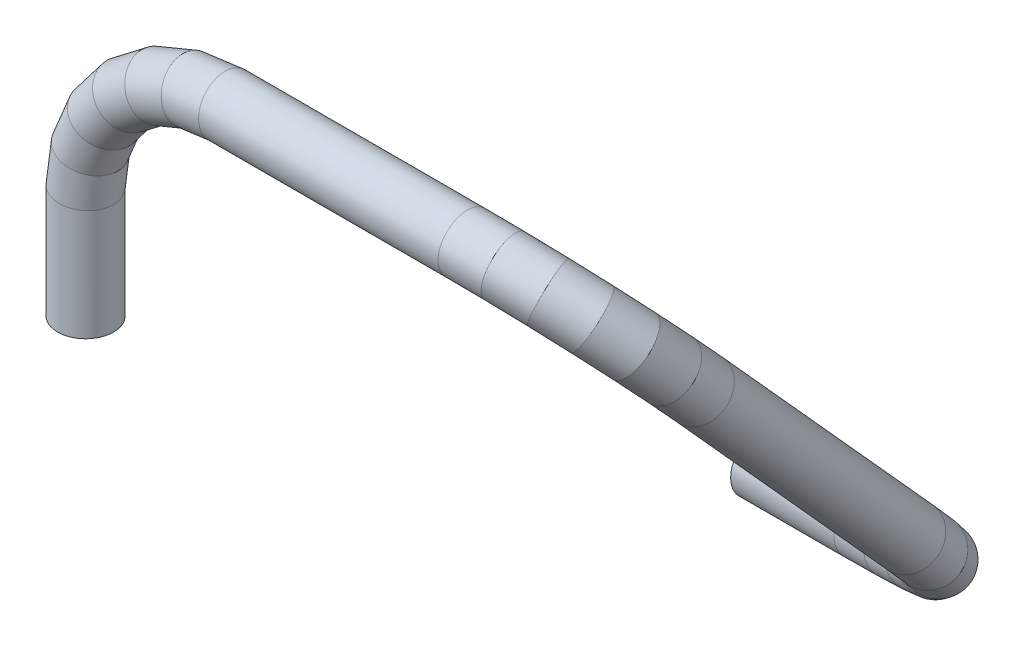
ISO-10303-21;
HEADER;
FILE_DESCRIPTION(('STEP AP214'),'2;1');
FILE_NAME('part.step','',(''),(''),'','','');
FILE_SCHEMA(('AUTOMOTIVE_DESIGN { 1 0 10303 214 1 1 1 1 }'));
ENDSEC;
DATA;
#1=APPLICATION_CONTEXT('core data for automotive mechanical design processes');
#2=APPLICATION_PROTOCOL_DEFINITION('international standard','automotive_design',2000,#1);
#3=PRODUCT_CONTEXT('',#1,'mechanical');
#4=PRODUCT('Part','Part','',(#3));
#5=PRODUCT_RELATED_PRODUCT_CATEGORY('part','',(#4));
#6=PRODUCT_DEFINITION_FORMATION('','',#4);
#7=PRODUCT_DEFINITION_CONTEXT('part definition',#1,'design');
#8=PRODUCT_DEFINITION('design','',#6,#7);
#9=PRODUCT_DEFINITION_SHAPE('','',#8);
#10=(LENGTH_UNIT() NAMED_UNIT(*) SI_UNIT(.MILLI.,.METRE.));
#11=(NAMED_UNIT(*) PLANE_ANGLE_UNIT() SI_UNIT($,.RADIAN.));
#12=(NAMED_UNIT(*) SI_UNIT($,.STERADIAN.) SOLID_ANGLE_UNIT());
#13=UNCERTAINTY_MEASURE_WITH_UNIT(LENGTH_MEASURE(1.E-05),#10,'distance_accuracy_value','');
#14=(GEOMETRIC_REPRESENTATION_CONTEXT(3) GLOBAL_UNCERTAINTY_ASSIGNED_CONTEXT((#13)) GLOBAL_UNIT_ASSIGNED_CONTEXT((#10,
#11,#12)) REPRESENTATION_CONTEXT('',''));
#15=CARTESIAN_POINT('',(0.,0.,0.));
#16=DIRECTION('',(0.,0.,1.));
#17=DIRECTION('',(1.,0.,0.));
#18=AXIS2_PLACEMENT_3D('',#15,#16,#17);
#19=CARTESIAN_POINT('',(20.,108.,0.));
#20=DIRECTION('',(0.,-1.,0.));
#21=DIRECTION('',(0.,0.,-1.));
#22=AXIS2_PLACEMENT_3D('',#19,#20,#21);
#23=CYLINDRICAL_SURFACE('',#22,3.8735);
#24=CARTESIAN_POINT('',(20.,108.,0.));
#25=DIRECTION('',(-0.0654031292301429,-0.997858923238603,0.));
#26=DIRECTION('',(-0.997858923238604,0.0654031292301429,0.));
#27=AXIS2_PLACEMENT_3D('',#24,#25,#26);
#28=ELLIPSE('',#27,3.88181125587208,3.8735);
#29=CARTESIAN_POINT('',(16.1265,108.253882603215,0.));
#30=VERTEX_POINT('',#29);
#31=EDGE_CURVE('E77',#30,#30,#28,.T.);
#32=ORIENTED_EDGE('',*,*,#31,.F.);
#33=EDGE_LOOP('',(#32));
#34=FACE_BOUND('',#33,.T.);
#35=CARTESIAN_POINT('',(20.,88.9,0.));
#36=DIRECTION('',(0.,-1.,0.));
#37=DIRECTION('',(0.,0.,-1.));
#38=AXIS2_PLACEMENT_3D('',#35,#36,#37);
#39=CIRCLE('',#38,3.8735);
#40=CARTESIAN_POINT('',(20.,88.9,-3.8735));
#41=VERTEX_POINT('',#40);
#42=EDGE_CURVE('E11',#41,#41,#39,.F.);
#43=ORIENTED_EDGE('',*,*,#42,.F.);
#44=EDGE_LOOP('',(#43));
#45=FACE_BOUND('',#44,.T.);
#46=ADVANCED_FACE('F58',(#34,#45),#23,.F.);
#47=CARTESIAN_POINT('',(20.,108.,0.));
#48=DIRECTION('',(0.,-1.,0.));
#49=DIRECTION('',(0.,0.,-1.));
#50=AXIS2_PLACEMENT_3D('',#47,#48,#49);
#51=CYLINDRICAL_SURFACE('',#50,4.7625);
#52=CARTESIAN_POINT('',(20.,108.,0.));
#53=DIRECTION('',(-0.0654031292301429,-0.997858923238603,0.));
#54=DIRECTION('',(-0.997858923238604,0.0654031292301429,0.));
#55=AXIS2_PLACEMENT_3D('',#52,#53,#54);
#56=ELLIPSE('',#55,4.77271875721977,4.7625);
#57=CARTESIAN_POINT('',(15.2375,108.312150741658,0.));
#58=VERTEX_POINT('',#57);
#59=EDGE_CURVE('E75',#58,#58,#56,.T.);
#60=ORIENTED_EDGE('',*,*,#59,.T.);
#61=EDGE_LOOP('',(#60));
#62=FACE_BOUND('',#61,.T.);
#63=CARTESIAN_POINT('',(20.,88.9,0.));
#64=DIRECTION('',(0.,-1.,0.));
#65=DIRECTION('',(0.,0.,-1.));
#66=AXIS2_PLACEMENT_3D('',#63,#64,#65);
#67=CIRCLE('',#66,4.7625);
#68=CARTESIAN_POINT('',(20.,88.9,-4.7625));
#69=VERTEX_POINT('',#68);
#70=EDGE_CURVE('E61',#69,#69,#67,.F.);
#71=ORIENTED_EDGE('',*,*,#70,.T.);
#72=EDGE_LOOP('',(#71));
#73=FACE_BOUND('',#72,.T.);
#74=ADVANCED_FACE('F65',(#62,#73),#51,.T.);
#75=CARTESIAN_POINT('',(20.8177801690624,114.21165708246,0.));
#76=DIRECTION('',(-0.130526192220051,-0.99144486137381,0.));
#77=DIRECTION('',(0.99144486137381,-0.130526192220051,0.));
#78=AXIS2_PLACEMENT_3D('',#75,#76,#77);
#79=CYLINDRICAL_SURFACE('',#78,4.7625);
#80=CARTESIAN_POINT('',(20.8177801690624,114.21165708246,0.));
#81=DIRECTION('',(-0.258819045102521,-0.965925826289068,0.));
#82=DIRECTION('',(-0.965925826289068,0.258819045102521,0.));
#83=AXIS2_PLACEMENT_3D('',#80,#81,#82);
#84=ELLIPSE('',#83,4.80359542476298,4.7625);
#85=CARTESIAN_POINT('',(16.1778632892398,115.454919063356,0.));
#86=VERTEX_POINT('',#85);
#87=EDGE_CURVE('E78',#86,#86,#84,.F.);
#88=ORIENTED_EDGE('',*,*,#87,.F.);
#89=EDGE_LOOP('',(#88));
#90=FACE_BOUND('',#89,.T.);
#91=ORIENTED_EDGE('',*,*,#59,.F.);
#92=EDGE_LOOP('',(#91));
#93=FACE_BOUND('',#92,.T.);
#94=ADVANCED_FACE('F215',(#90,#93),#79,.T.);
#95=CARTESIAN_POINT('',(20.8177801690624,114.21165708246,0.));
#96=DIRECTION('',(-0.130526192220051,-0.99144486137381,0.));
#97=DIRECTION('',(0.99144486137381,-0.130526192220051,0.));
#98=AXIS2_PLACEMENT_3D('',#95,#96,#97);
#99=CYLINDRICAL_SURFACE('',#98,3.8735);
#100=CARTESIAN_POINT('',(20.8177801690624,114.21165708246,0.));
#101=DIRECTION('',(-0.258819045102521,-0.965925826289068,0.));
#102=DIRECTION('',(-0.965925826289068,0.258819045102521,0.));
#103=AXIS2_PLACEMENT_3D('',#100,#101,#102);
#104=ELLIPSE('',#103,3.90692427880722,3.8735);
#105=CARTESIAN_POINT('',(17.0439811068067,115.222843493589,0.));
#106=VERTEX_POINT('',#105);
#107=EDGE_CURVE('E80',#106,#106,#104,.F.);
#108=ORIENTED_EDGE('',*,*,#107,.T.);
#109=EDGE_LOOP('',(#108));
#110=FACE_BOUND('',#109,.T.);
#111=ORIENTED_EDGE('',*,*,#31,.T.);
#112=EDGE_LOOP('',(#111));
#113=FACE_BOUND('',#112,.T.);
#114=ADVANCED_FACE('F202',(#110,#113),#99,.F.);
#115=CARTESIAN_POINT('',(23.2153903091735,120.,0.));
#116=DIRECTION('',(-0.38268343236509,-0.923879532511287,0.));
#117=DIRECTION('',(0.923879532511287,-0.38268343236509,0.));
#118=AXIS2_PLACEMENT_3D('',#115,#116,#117);
#119=CYLINDRICAL_SURFACE('',#118,3.8735);
#120=CARTESIAN_POINT('',(23.2153903091735,120.,0.));
#121=DIRECTION('',(-0.5,-0.866025403784439,0.));
#122=DIRECTION('',(-0.866025403784439,0.5,0.));
#123=AXIS2_PLACEMENT_3D('',#120,#121,#122);
#124=ELLIPSE('',#123,3.90692427880722,3.8735);
#125=CARTESIAN_POINT('',(19.8318946330642,121.953462139404,0.));
#126=VERTEX_POINT('',#125);
#127=EDGE_CURVE('E81',#126,#126,#124,.T.);
#128=ORIENTED_EDGE('',*,*,#127,.F.);
#129=EDGE_LOOP('',(#128));
#130=FACE_BOUND('',#129,.T.);
#131=ORIENTED_EDGE('',*,*,#107,.F.);
#132=EDGE_LOOP('',(#131));
#133=FACE_BOUND('',#132,.T.);
#134=ADVANCED_FACE('F220',(#130,#133),#119,.F.);
#135=CARTESIAN_POINT('',(23.2153903091735,120.,0.));
#136=DIRECTION('',(-0.38268343236509,-0.923879532511287,0.));
#137=DIRECTION('',(0.923879532511287,-0.38268343236509,0.));
#138=AXIS2_PLACEMENT_3D('',#135,#136,#137);
#139=CYLINDRICAL_SURFACE('',#138,4.7625);
#140=CARTESIAN_POINT('',(23.2153903091735,120.,0.));
#141=DIRECTION('',(-0.5,-0.866025403784439,0.));
#142=DIRECTION('',(-0.866025403784439,0.5,0.));
#143=AXIS2_PLACEMENT_3D('',#140,#141,#142);
#144=ELLIPSE('',#143,4.80359542476298,4.7625);
#145=CARTESIAN_POINT('',(19.055354641826,122.401797712381,0.));
#146=VERTEX_POINT('',#145);
#147=EDGE_CURVE('E82',#146,#146,#144,.T.);
#148=ORIENTED_EDGE('',*,*,#147,.T.);
#149=EDGE_LOOP('',(#148));
#150=FACE_BOUND('',#149,.T.);
#151=ORIENTED_EDGE('',*,*,#87,.T.);
#152=EDGE_LOOP('',(#151));
#153=FACE_BOUND('',#152,.T.);
#154=ADVANCED_FACE('F225',(#150,#153),#139,.T.);
#155=CARTESIAN_POINT('',(27.0294372515229,124.970562748477,0.));
#156=DIRECTION('',(-0.608761429008721,-0.793353340291235,0.));
#157=DIRECTION('',(0.793353340291235,-0.608761429008721,0.));
#158=AXIS2_PLACEMENT_3D('',#155,#156,#157);
#159=CYLINDRICAL_SURFACE('',#158,4.7625);
#160=CARTESIAN_POINT('',(27.0294372515229,124.970562748477,0.));
#161=DIRECTION('',(-0.707106781186547,-0.707106781186548,0.));
#162=DIRECTION('',(-0.707106781186548,0.707106781186547,0.));
#163=AXIS2_PLACEMENT_3D('',#160,#161,#162);
#164=ELLIPSE('',#163,4.80359542476298,4.7625);
#165=CARTESIAN_POINT('',(23.6327823525963,128.367217647404,0.));
#166=VERTEX_POINT('',#165);
#167=EDGE_CURVE('E86',#166,#166,#164,.F.);
#168=ORIENTED_EDGE('',*,*,#167,.F.);
#169=EDGE_LOOP('',(#168));
#170=FACE_BOUND('',#169,.T.);
#171=ORIENTED_EDGE('',*,*,#147,.F.);
#172=EDGE_LOOP('',(#171));
#173=FACE_BOUND('',#172,.T.);
#174=ADVANCED_FACE('F223',(#170,#173),#159,.T.);
#175=CARTESIAN_POINT('',(27.0294372515229,124.970562748477,0.));
#176=DIRECTION('',(-0.608761429008721,-0.793353340291235,0.));
#177=DIRECTION('',(0.793353340291235,-0.608761429008721,0.));
#178=AXIS2_PLACEMENT_3D('',#175,#176,#177);
#179=CYLINDRICAL_SURFACE('',#178,3.8735);
#180=CARTESIAN_POINT('',(27.0294372515229,124.970562748477,0.));
#181=DIRECTION('',(-0.707106781186547,-0.707106781186548,0.));
#182=DIRECTION('',(-0.707106781186548,0.707106781186547,0.));
#183=AXIS2_PLACEMENT_3D('',#180,#181,#182);
#184=ELLIPSE('',#183,3.90692427880722,3.8735);
#185=CARTESIAN_POINT('',(24.2668246003959,127.733175399604,0.));
#186=VERTEX_POINT('',#185);
#187=EDGE_CURVE('E83',#186,#186,#184,.F.);
#188=ORIENTED_EDGE('',*,*,#187,.T.);
#189=EDGE_LOOP('',(#188));
#190=FACE_BOUND('',#189,.T.);
#191=ORIENTED_EDGE('',*,*,#127,.T.);
#192=EDGE_LOOP('',(#191));
#193=FACE_BOUND('',#192,.T.);
#194=ADVANCED_FACE('F228',(#190,#193),#179,.F.);
#195=CARTESIAN_POINT('',(32.,128.784609690827,0.));
#196=DIRECTION('',(-0.793353340291235,-0.608761429008721,0.));
#197=DIRECTION('',(0.608761429008721,-0.793353340291235,0.));
#198=AXIS2_PLACEMENT_3D('',#195,#196,#197);
#199=CYLINDRICAL_SURFACE('',#198,3.8735);
#200=CARTESIAN_POINT('',(32.,128.784609690827,0.));
#201=DIRECTION('',(-0.866025403784438,-0.5,0.));
#202=DIRECTION('',(-0.5,0.866025403784439,0.));
#203=AXIS2_PLACEMENT_3D('',#200,#201,#202);
#204=ELLIPSE('',#203,3.90692427880722,3.8735);
#205=CARTESIAN_POINT('',(30.0465378605964,132.168105366936,0.));
#206=VERTEX_POINT('',#205);
#207=EDGE_CURVE('E95',#206,#206,#204,.T.);
#208=ORIENTED_EDGE('',*,*,#207,.F.);
#209=EDGE_LOOP('',(#208));
#210=FACE_BOUND('',#209,.T.);
#211=ORIENTED_EDGE('',*,*,#187,.F.);
#212=EDGE_LOOP('',(#211));
#213=FACE_BOUND('',#212,.T.);
#214=ADVANCED_FACE('F235',(#210,#213),#199,.F.);
#215=CARTESIAN_POINT('',(32.,128.784609690827,0.));
#216=DIRECTION('',(-0.793353340291235,-0.608761429008721,0.));
#217=DIRECTION('',(0.608761429008721,-0.793353340291235,0.));
#218=AXIS2_PLACEMENT_3D('',#215,#216,#217);
#219=CYLINDRICAL_SURFACE('',#218,4.7625);
#220=CARTESIAN_POINT('',(32.,128.784609690827,0.));
#221=DIRECTION('',(-0.866025403784438,-0.5,0.));
#222=DIRECTION('',(-0.5,0.866025403784439,0.));
#223=AXIS2_PLACEMENT_3D('',#220,#221,#222);
#224=ELLIPSE('',#223,4.80359542476298,4.7625);
#225=CARTESIAN_POINT('',(29.5982022876185,132.944645358174,0.));
#226=VERTEX_POINT('',#225);
#227=EDGE_CURVE('E90',#226,#226,#224,.T.);
#228=ORIENTED_EDGE('',*,*,#227,.T.);
#229=EDGE_LOOP('',(#228));
#230=FACE_BOUND('',#229,.T.);
#231=ORIENTED_EDGE('',*,*,#167,.T.);
#232=EDGE_LOOP('',(#231));
#233=FACE_BOUND('',#232,.T.);
#234=ADVANCED_FACE('F236',(#230,#233),#219,.T.);
#235=CARTESIAN_POINT('',(37.7883429175395,131.182219830938,0.));
#236=DIRECTION('',(-0.923879532511287,-0.38268343236509,0.));
#237=DIRECTION('',(0.38268343236509,-0.923879532511287,0.));
#238=AXIS2_PLACEMENT_3D('',#235,#236,#237);
#239=CYLINDRICAL_SURFACE('',#238,4.7625);
#240=CARTESIAN_POINT('',(37.7883429175395,131.182219830938,0.));
#241=DIRECTION('',(-0.965925826289068,-0.258819045102521,0.));
#242=DIRECTION('',(-0.258819045102521,0.965925826289068,0.));
#243=AXIS2_PLACEMENT_3D('',#240,#241,#242);
#244=ELLIPSE('',#243,4.80359542476298,4.7625);
#245=CARTESIAN_POINT('',(36.5450809366435,135.82213671076,0.));
#246=VERTEX_POINT('',#245);
#247=EDGE_CURVE('E96',#246,#246,#244,.F.);
#248=ORIENTED_EDGE('',*,*,#247,.F.);
#249=EDGE_LOOP('',(#248));
#250=FACE_BOUND('',#249,.T.);
#251=ORIENTED_EDGE('',*,*,#227,.F.);
#252=EDGE_LOOP('',(#251));
#253=FACE_BOUND('',#252,.T.);
#254=ADVANCED_FACE('F242',(#250,#253),#239,.T.);
#255=CARTESIAN_POINT('',(37.7883429175395,131.182219830938,0.));
#256=DIRECTION('',(-0.923879532511287,-0.38268343236509,0.));
#257=DIRECTION('',(0.38268343236509,-0.923879532511287,0.));
#258=AXIS2_PLACEMENT_3D('',#255,#256,#257);
#259=CYLINDRICAL_SURFACE('',#258,3.8735);
#260=CARTESIAN_POINT('',(37.7883429175395,131.182219830938,0.));
#261=DIRECTION('',(-0.965925826289068,-0.258819045102521,0.));
#262=DIRECTION('',(-0.258819045102521,0.965925826289068,0.));
#263=AXIS2_PLACEMENT_3D('',#260,#261,#262);
#264=ELLIPSE('',#263,3.90692427880722,3.8735);
#265=CARTESIAN_POINT('',(36.7771565064108,134.956018893193,0.));
#266=VERTEX_POINT('',#265);
#267=EDGE_CURVE('E91',#266,#266,#264,.F.);
#268=ORIENTED_EDGE('',*,*,#267,.T.);
#269=EDGE_LOOP('',(#268));
#270=FACE_BOUND('',#269,.T.);
#271=ORIENTED_EDGE('',*,*,#207,.T.);
#272=EDGE_LOOP('',(#271));
#273=FACE_BOUND('',#272,.T.);
#274=ADVANCED_FACE('F247',(#270,#273),#259,.F.);
#275=CARTESIAN_POINT('',(44.,132.,0.));
#276=DIRECTION('',(-0.99144486137381,-0.130526192220052,0.));
#277=DIRECTION('',(0.130526192220052,-0.99144486137381,0.));
#278=AXIS2_PLACEMENT_3D('',#275,#276,#277);
#279=CYLINDRICAL_SURFACE('',#278,3.8735);
#280=CARTESIAN_POINT('',(44.,132.,0.));
#281=DIRECTION('',(-0.997858923238603,-0.0654031292301435,0.));
#282=DIRECTION('',(-0.0654031292301435,0.997858923238603,0.));
#283=AXIS2_PLACEMENT_3D('',#280,#281,#282);
#284=ELLIPSE('',#283,3.88181125587208,3.8735);
#285=CARTESIAN_POINT('',(43.7461173967852,135.8735,0.));
#286=VERTEX_POINT('',#285);
#287=EDGE_CURVE('E99',#286,#286,#284,.T.);
#288=ORIENTED_EDGE('',*,*,#287,.F.);
#289=EDGE_LOOP('',(#288));
#290=FACE_BOUND('',#289,.T.);
#291=ORIENTED_EDGE('',*,*,#267,.F.);
#292=EDGE_LOOP('',(#291));
#293=FACE_BOUND('',#292,.T.);
#294=ADVANCED_FACE('F246',(#290,#293),#279,.F.);
#295=CARTESIAN_POINT('',(44.,132.,0.));
#296=DIRECTION('',(-0.99144486137381,-0.130526192220052,0.));
#297=DIRECTION('',(0.130526192220052,-0.99144486137381,0.));
#298=AXIS2_PLACEMENT_3D('',#295,#296,#297);
#299=CYLINDRICAL_SURFACE('',#298,4.7625);
#300=CARTESIAN_POINT('',(44.,132.,0.));
#301=DIRECTION('',(-0.997858923238603,-0.0654031292301435,0.));
#302=DIRECTION('',(-0.0654031292301435,0.997858923238603,0.));
#303=AXIS2_PLACEMENT_3D('',#300,#301,#302);
#304=ELLIPSE('',#303,4.77271875721977,4.7625);
#305=CARTESIAN_POINT('',(43.6878492583424,136.7625,0.));
#306=VERTEX_POINT('',#305);
#307=EDGE_CURVE('E100',#306,#306,#304,.T.);
#308=ORIENTED_EDGE('',*,*,#307,.T.);
#309=EDGE_LOOP('',(#308));
#310=FACE_BOUND('',#309,.T.);
#311=ORIENTED_EDGE('',*,*,#247,.T.);
#312=EDGE_LOOP('',(#311));
#313=FACE_BOUND('',#312,.T.);
#314=ADVANCED_FACE('F255',(#310,#313),#299,.T.);
#315=CARTESIAN_POINT('',(84.5,132.,0.));
#316=DIRECTION('',(-1.,0.,0.));
#317=DIRECTION('',(0.,0.,1.));
#318=AXIS2_PLACEMENT_3D('',#315,#316,#317);
#319=CYLINDRICAL_SURFACE('',#318,4.7625);
#320=CARTESIAN_POINT('',(84.5,132.,0.));
#321=DIRECTION('',(-0.997858923238604,0.0485516940798315,0.0438212541476518));
#322=DIRECTION('',(0.0654031292301419,0.740755706128859,0.668583139575357));
#323=AXIS2_PLACEMENT_3D('',#320,#321,#322);
#324=ELLIPSE('',#323,4.77271875721977,4.7625);
#325=CARTESIAN_POINT('',(84.8121507416576,135.535418653159,3.19095929101219));
#326=VERTEX_POINT('',#325);
#327=EDGE_CURVE('E102',#326,#326,#324,.F.);
#328=ORIENTED_EDGE('',*,*,#327,.F.);
#329=EDGE_LOOP('',(#328));
#330=FACE_BOUND('',#329,.T.);
#331=ORIENTED_EDGE('',*,*,#307,.F.);
#332=EDGE_LOOP('',(#331));
#333=FACE_BOUND('',#332,.T.);
#334=ADVANCED_FACE('F260',(#330,#333),#319,.T.);
#335=CARTESIAN_POINT('',(84.5,132.,0.));
#336=DIRECTION('',(-1.,0.,0.));
#337=DIRECTION('',(0.,0.,1.));
#338=AXIS2_PLACEMENT_3D('',#335,#336,#337);
#339=CYLINDRICAL_SURFACE('',#338,3.8735);
#340=CARTESIAN_POINT('',(84.5,132.,0.));
#341=DIRECTION('',(-0.997858923238604,0.0485516940798315,0.0438212541476518));
#342=DIRECTION('',(0.0654031292301419,0.740755706128859,0.668583139575357));
#343=AXIS2_PLACEMENT_3D('',#340,#341,#342);
#344=ELLIPSE('',#343,3.88181125587208,3.8735);
#345=CARTESIAN_POINT('',(84.7538826032148,134.875473837902,2.59531355668991));
#346=VERTEX_POINT('',#345);
#347=EDGE_CURVE('E101',#346,#346,#344,.F.);
#348=ORIENTED_EDGE('',*,*,#347,.T.);
#349=EDGE_LOOP('',(#348));
#350=FACE_BOUND('',#349,.T.);
#351=ORIENTED_EDGE('',*,*,#287,.T.);
#352=EDGE_LOOP('',(#351));
#353=FACE_BOUND('',#352,.T.);
#354=ADVANCED_FACE('F265',(#350,#353),#339,.F.);
#355=CARTESIAN_POINT('',(90.7116570824605,131.392924878974,-0.547927187081367));
#356=DIRECTION('',(-0.991444861373811,0.0968954823518215,0.087454858957482));
#357=DIRECTION('',(-0.0972681669321937,-0.995258209562549,0.));
#358=AXIS2_PLACEMENT_3D('',#355,#356,#357);
#359=CYLINDRICAL_SURFACE('',#358,3.8735);
#360=CARTESIAN_POINT('',(90.7116570824605,131.392924878974,-0.547927187081367));
#361=DIRECTION('',(-0.965925826289068,0.192133056136109,0.173413341031133));
#362=DIRECTION('',(0.258819045102522,0.717050327313455,0.647187399438436));
#363=AXIS2_PLACEMENT_3D('',#360,#361,#362);
#364=ELLIPSE('',#363,3.90692427880723,3.8735);
#365=CARTESIAN_POINT('',(91.7228434935893,134.194386211882,1.98058497672277));
#366=VERTEX_POINT('',#365);
#367=EDGE_CURVE('E107',#366,#366,#364,.T.);
#368=ORIENTED_EDGE('',*,*,#367,.F.);
#369=EDGE_LOOP('',(#368));
#370=FACE_BOUND('',#369,.T.);
#371=ORIENTED_EDGE('',*,*,#347,.F.);
#372=EDGE_LOOP('',(#371));
#373=FACE_BOUND('',#372,.T.);
#374=ADVANCED_FACE('F264',(#370,#373),#359,.F.);
#375=CARTESIAN_POINT('',(90.7116570824605,131.392924878974,-0.547927187081367));
#376=DIRECTION('',(-0.991444861373811,0.0968954823518215,0.087454858957482));
#377=DIRECTION('',(-0.0972681669321937,-0.995258209562549,0.));
#378=AXIS2_PLACEMENT_3D('',#375,#376,#377);
#379=CYLINDRICAL_SURFACE('',#378,4.7625);
#380=CARTESIAN_POINT('',(90.7116570824605,131.392924878974,-0.547927187081367));
#381=DIRECTION('',(-0.965925826289068,0.192133056136109,0.173413341031133));
#382=DIRECTION('',(0.258819045102522,0.717050327313455,0.647187399438436));
#383=AXIS2_PLACEMENT_3D('',#380,#381,#382);
#384=ELLIPSE('',#383,4.80359542476298,4.7625);
#385=CARTESIAN_POINT('',(91.9549190633565,134.837344550582,2.56089924382536));
#386=VERTEX_POINT('',#385);
#387=EDGE_CURVE('E104',#386,#386,#384,.T.);
#388=ORIENTED_EDGE('',*,*,#387,.T.);
#389=EDGE_LOOP('',(#388));
#390=FACE_BOUND('',#389,.T.);
#391=ORIENTED_EDGE('',*,*,#327,.T.);
#392=EDGE_LOOP('',(#391));
#393=FACE_BOUND('',#392,.T.);
#394=ADVANCED_FACE('F269',(#390,#393),#379,.T.);
#395=CARTESIAN_POINT('',(96.5,129.613070682155,-2.15436841601836));
#396=DIRECTION('',(-0.923879532511285,0.284083180060561,0.256404672760481));
#397=DIRECTION('',(-0.293908687527917,-0.955833501921552,0.));
#398=AXIS2_PLACEMENT_3D('',#395,#396,#397);
#399=CYLINDRICAL_SURFACE('',#398,4.7625);
#400=CARTESIAN_POINT('',(96.5,129.613070682155,-2.15436841601836));
#401=DIRECTION('',(-0.866025403784437,0.37117256201143,0.335008849450091));
#402=DIRECTION('',(0.500000000000002,0.642889735779286,0.580252348232764));
#403=AXIS2_PLACEMENT_3D('',#400,#401,#402);
#404=ELLIPSE('',#403,4.80359542476298,4.7625);
#405=CARTESIAN_POINT('',(98.9017977123815,132.701252875571,0.632929109160526));
#406=VERTEX_POINT('',#405);
#407=EDGE_CURVE('E115',#406,#406,#404,.F.);
#408=ORIENTED_EDGE('',*,*,#407,.F.);
#409=EDGE_LOOP('',(#408));
#410=FACE_BOUND('',#409,.T.);
#411=ORIENTED_EDGE('',*,*,#387,.F.);
#412=EDGE_LOOP('',(#411));
#413=FACE_BOUND('',#412,.T.);
#414=ADVANCED_FACE('F272',(#410,#413),#399,.T.);
#415=CARTESIAN_POINT('',(96.5,129.613070682155,-2.15436841601836));
#416=DIRECTION('',(-0.923879532511285,0.284083180060561,0.256404672760481));
#417=DIRECTION('',(-0.293908687527917,-0.955833501921552,0.));
#418=AXIS2_PLACEMENT_3D('',#415,#416,#417);
#419=CYLINDRICAL_SURFACE('',#418,3.8735);
#420=CARTESIAN_POINT('',(96.5,129.613070682155,-2.15436841601836));
#421=DIRECTION('',(-0.866025403784437,0.37117256201143,0.335008849450091));
#422=DIRECTION('',(0.500000000000002,0.642889735779286,0.580252348232764));
#423=AXIS2_PLACEMENT_3D('',#420,#421,#422);
#424=ELLIPSE('',#423,3.90692427880722,3.8735);
#425=CARTESIAN_POINT('',(98.4534621394036,132.124792199467,0.112633571127135));
#426=VERTEX_POINT('',#425);
#427=EDGE_CURVE('E108',#426,#426,#424,.F.);
#428=ORIENTED_EDGE('',*,*,#427,.T.);
#429=EDGE_LOOP('',(#428));
#430=FACE_BOUND('',#429,.T.);
#431=ORIENTED_EDGE('',*,*,#367,.T.);
#432=EDGE_LOOP('',(#431));
#433=FACE_BOUND('',#432,.T.);
#434=ADVANCED_FACE('F279',(#430,#433),#419,.F.);
#435=CARTESIAN_POINT('',(101.470562748477,126.781731531707,-4.70984737182857));
#436=DIRECTION('',(-0.793353340291235,0.451911078517808,0.407880931843609));
#437=DIRECTION('',(-0.494954755331907,-0.868918747740162,0.));
#438=AXIS2_PLACEMENT_3D('',#435,#436,#437);
#439=CYLINDRICAL_SURFACE('',#438,3.8735);
#440=CARTESIAN_POINT('',(101.470562748477,126.781731531707,-4.70984737182857));
#441=DIRECTION('',(-0.707106781186547,0.524917271177327,0.473774058407326));
#442=DIRECTION('',(0.707106781186548,0.524917271177324,0.47377405840733));
#443=AXIS2_PLACEMENT_3D('',#440,#441,#442);
#444=ELLIPSE('',#443,3.90692427880722,3.8735);
#445=CARTESIAN_POINT('',(104.233175399604,128.832543562835,-2.85884800036794));
#446=VERTEX_POINT('',#445);
#447=EDGE_CURVE('E117',#446,#446,#444,.T.);
#448=ORIENTED_EDGE('',*,*,#447,.F.);
#449=EDGE_LOOP('',(#448));
#450=FACE_BOUND('',#449,.T.);
#451=ORIENTED_EDGE('',*,*,#427,.F.);
#452=EDGE_LOOP('',(#451));
#453=FACE_BOUND('',#452,.T.);
#454=ADVANCED_FACE('F282',(#450,#453),#439,.F.);
#455=CARTESIAN_POINT('',(101.470562748477,126.781731531707,-4.70984737182857));
#456=DIRECTION('',(-0.793353340291235,0.451911078517808,0.407880931843609));
#457=DIRECTION('',(-0.494954755331907,-0.868918747740162,0.));
#458=AXIS2_PLACEMENT_3D('',#455,#456,#457);
#459=CYLINDRICAL_SURFACE('',#458,4.7625);
#460=CARTESIAN_POINT('',(101.470562748477,126.781731531707,-4.70984737182857));
#461=DIRECTION('',(-0.707106781186547,0.524917271177327,0.473774058407326));
#462=DIRECTION('',(0.707106781186548,0.524917271177324,0.47377405840733));
#463=AXIS2_PLACEMENT_3D('',#460,#461,#462);
#464=ELLIPSE('',#463,4.80359542476298,4.7625);
#465=CARTESIAN_POINT('',(104.867217647404,129.303221733914,-2.43402847249173));
#466=VERTEX_POINT('',#465);
#467=EDGE_CURVE('E114',#466,#466,#464,.T.);
#468=ORIENTED_EDGE('',*,*,#467,.T.);
#469=EDGE_LOOP('',(#468));
#470=FACE_BOUND('',#469,.T.);
#471=ORIENTED_EDGE('',*,*,#407,.T.);
#472=EDGE_LOOP('',(#471));
#473=FACE_BOUND('',#472,.T.);
#474=ADVANCED_FACE('F287',(#470,#473),#459,.T.);
#475=CARTESIAN_POINT('',(105.284609690827,123.091858511726,-8.04021238680219));
#476=DIRECTION('',(-0.60876142900872,0.588941983792441,0.531560779476708));
#477=DIRECTION('',(-0.695310474576563,-0.718709498993936,0.));
#478=AXIS2_PLACEMENT_3D('',#475,#476,#477);
#479=CYLINDRICAL_SURFACE('',#478,4.7625);
#480=CARTESIAN_POINT('',(105.284609690827,123.091858511726,-8.04021238680219));
#481=DIRECTION('',(-0.5,0.6428897357793,0.580252348232751));
#482=DIRECTION('',(0.866025403784439,0.37117256201143,0.335008849450087));
#483=AXIS2_PLACEMENT_3D('',#480,#481,#482);
#484=ELLIPSE('',#483,4.80359542476298,4.7625);
#485=CARTESIAN_POINT('',(109.444645358174,124.874821332401,-6.43096541032864));
#486=VERTEX_POINT('',#485);
#487=EDGE_CURVE('E118',#486,#486,#484,.F.);
#488=ORIENTED_EDGE('',*,*,#487,.F.);
#489=EDGE_LOOP('',(#488));
#490=FACE_BOUND('',#489,.T.);
#491=ORIENTED_EDGE('',*,*,#467,.F.);
#492=EDGE_LOOP('',(#491));
#493=FACE_BOUND('',#492,.T.);
#494=ADVANCED_FACE('F286',(#490,#493),#479,.T.);
#495=CARTESIAN_POINT('',(105.284609690827,123.091858511726,-8.04021238680219));
#496=DIRECTION('',(-0.60876142900872,0.588941983792441,0.531560779476708));
#497=DIRECTION('',(-0.695310474576563,-0.718709498993936,0.));
#498=AXIS2_PLACEMENT_3D('',#495,#496,#497);
#499=CYLINDRICAL_SURFACE('',#498,3.8735);
#500=CARTESIAN_POINT('',(105.284609690827,123.091858511726,-8.04021238680219));
#501=DIRECTION('',(-0.5,0.6428897357793,0.580252348232751));
#502=DIRECTION('',(0.866025403784439,0.37117256201143,0.335008849450087));
#503=AXIS2_PLACEMENT_3D('',#500,#501,#502);
#504=ELLIPSE('',#503,3.90692427880722,3.8735);
#505=CARTESIAN_POINT('',(108.668105366936,124.542001605875,-6.73135817927037));
#506=VERTEX_POINT('',#505);
#507=EDGE_CURVE('E120',#506,#506,#504,.F.);
#508=ORIENTED_EDGE('',*,*,#507,.T.);
#509=EDGE_LOOP('',(#508));
#510=FACE_BOUND('',#509,.T.);
#511=ORIENTED_EDGE('',*,*,#447,.T.);
#512=EDGE_LOOP('',(#511));
#513=FACE_BOUND('',#512,.T.);
#514=ADVANCED_FACE('F294',(#510,#513),#499,.F.);
#515=CARTESIAN_POINT('',(107.682219830938,118.794910370718,-11.9185045888572));
#516=DIRECTION('',(-0.38268343236509,0.685837466144266,0.619015638434188));
#517=DIRECTION('',(0.,-0.670017698900182,0.742345124022853));
#518=AXIS2_PLACEMENT_3D('',#515,#516,#517);
#519=CYLINDRICAL_SURFACE('',#518,3.8735);
#520=CARTESIAN_POINT('',(107.682219830938,118.794910370718,-11.9185045888572));
#521=DIRECTION('',(-0.258819045102521,0.717050327313435,0.647187399438458));
#522=DIRECTION('',(0.965925826289068,0.192133056136109,0.173413341031132));
#523=AXIS2_PLACEMENT_3D('',#520,#521,#522);
#524=ELLIPSE('',#523,3.90692427880722,3.8735);
#525=CARTESIAN_POINT('',(111.456018893193,119.545559672498,-11.2409917965136));
#526=VERTEX_POINT('',#525);
#527=EDGE_CURVE('E121',#526,#526,#524,.T.);
#528=ORIENTED_EDGE('',*,*,#527,.F.);
#529=EDGE_LOOP('',(#528));
#530=FACE_BOUND('',#529,.T.);
#531=ORIENTED_EDGE('',*,*,#507,.F.);
#532=EDGE_LOOP('',(#531));
#533=FACE_BOUND('',#532,.T.);
#534=ADVANCED_FACE('F300',(#530,#533),#519,.F.);
#535=CARTESIAN_POINT('',(107.682219830938,118.794910370718,-11.9185045888572));
#536=DIRECTION('',(-0.38268343236509,0.685837466144266,0.619015638434188));
#537=DIRECTION('',(0.,-0.670017698900182,0.742345124022853));
#538=AXIS2_PLACEMENT_3D('',#535,#536,#537);
#539=CYLINDRICAL_SURFACE('',#538,4.7625);
#540=CARTESIAN_POINT('',(107.682219830938,118.794910370718,-11.9185045888572));
#541=DIRECTION('',(-0.258819045102521,0.717050327313435,0.647187399438458));
#542=DIRECTION('',(0.965925826289068,0.192133056136109,0.173413341031132));
#543=AXIS2_PLACEMENT_3D('',#540,#541,#542);
#544=ELLIPSE('',#543,4.80359542476298,4.7625);
#545=CARTESIAN_POINT('',(112.32213671076,119.717839840119,-11.0854970572872));
#546=VERTEX_POINT('',#545);
#547=EDGE_CURVE('E122',#546,#546,#544,.T.);
#548=ORIENTED_EDGE('',*,*,#547,.T.);
#549=EDGE_LOOP('',(#548));
#550=FACE_BOUND('',#549,.T.);
#551=ORIENTED_EDGE('',*,*,#487,.T.);
#552=EDGE_LOOP('',(#551));
#553=FACE_BOUND('',#552,.T.);
#554=ADVANCED_FACE('F304',(#550,#553),#539,.T.);
#555=CARTESIAN_POINT('',(108.5,114.183717023452,-16.0804247736044));
#556=DIRECTION('',(-0.130526192220052,0.735994258578362,0.66428560460409));
#557=DIRECTION('',(0.,-0.670017698900182,0.742345124022853));
#558=AXIS2_PLACEMENT_3D('',#555,#556,#557);
#559=CYLINDRICAL_SURFACE('',#558,4.7625);
#560=CARTESIAN_POINT('',(108.5,114.183717023452,-16.0804247736044));
#561=DIRECTION('',(-0.0654031292301434,0.740755706128872,0.668583139575342));
#562=DIRECTION('',(0.997858923238604,0.0485516940798318,0.0438212541476538));
#563=AXIS2_PLACEMENT_3D('',#560,#561,#562);
#564=ELLIPSE('',#563,4.77271875721977,4.7625);
#565=CARTESIAN_POINT('',(113.2625,114.415440604481,-15.871278251969));
#566=VERTEX_POINT('',#565);
#567=EDGE_CURVE('E126',#566,#566,#564,.F.);
#568=ORIENTED_EDGE('',*,*,#567,.F.);
#569=EDGE_LOOP('',(#568));
#570=FACE_BOUND('',#569,.T.);
#571=ORIENTED_EDGE('',*,*,#547,.F.);
#572=EDGE_LOOP('',(#571));
#573=FACE_BOUND('',#572,.T.);
#574=ADVANCED_FACE('F303',(#570,#573),#559,.T.);
#575=CARTESIAN_POINT('',(108.5,114.183717023452,-16.0804247736044));
#576=DIRECTION('',(-0.130526192220052,0.735994258578362,0.66428560460409));
#577=DIRECTION('',(0.,-0.670017698900182,0.742345124022853));
#578=AXIS2_PLACEMENT_3D('',#575,#576,#577);
#579=CYLINDRICAL_SURFACE('',#578,3.8735);
#580=CARTESIAN_POINT('',(108.5,114.183717023452,-16.0804247736044));
#581=DIRECTION('',(-0.0654031292301434,0.740755706128872,0.668583139575342));
#582=DIRECTION('',(0.997858923238604,0.0485516940798318,0.0438212541476538));
#583=AXIS2_PLACEMENT_3D('',#580,#581,#582);
#584=ELLIPSE('',#583,3.88181125587208,3.8735);
#585=CARTESIAN_POINT('',(112.3735,114.372185536022,-15.9103189360076));
#586=VERTEX_POINT('',#585);
#587=EDGE_CURVE('E123',#586,#586,#584,.F.);
#588=ORIENTED_EDGE('',*,*,#587,.T.);
#589=EDGE_LOOP('',(#588));
#590=FACE_BOUND('',#589,.T.);
#591=ORIENTED_EDGE('',*,*,#527,.T.);
#592=EDGE_LOOP('',(#591));
#593=FACE_BOUND('',#592,.T.);
#594=ADVANCED_FACE('F309',(#590,#593),#579,.F.);
#595=CARTESIAN_POINT('',(108.5,74.7029864338072,-51.7145084424252));
#596=DIRECTION('',(0.,0.742345124022853,0.670017698900182));
#597=DIRECTION('',(0.,-0.670017698900182,0.742345124022853));
#598=AXIS2_PLACEMENT_3D('',#595,#596,#597);
#599=CYLINDRICAL_SURFACE('',#598,3.8735);
#600=CARTESIAN_POINT('',(108.5,74.7029864338072,-51.7145084424252));
#601=DIRECTION('',(0.0654031292301435,0.740755706128871,0.668583139575343));
#602=DIRECTION('',(0.997858923238603,-0.0485516940798403,-0.0438212541476444));
#603=AXIS2_PLACEMENT_3D('',#600,#601,#602);
#604=ELLIPSE('',#603,3.88181125587208,3.8735);
#605=CARTESIAN_POINT('',(112.3735,74.5145179212364,-51.8846142800219));
#606=VERTEX_POINT('',#605);
#607=EDGE_CURVE('E135',#606,#606,#604,.T.);
#608=ORIENTED_EDGE('',*,*,#607,.F.);
#609=EDGE_LOOP('',(#608));
#610=FACE_BOUND('',#609,.T.);
#611=ORIENTED_EDGE('',*,*,#587,.F.);
#612=EDGE_LOOP('',(#611));
#613=FACE_BOUND('',#612,.T.);
#614=ADVANCED_FACE('F311',(#610,#613),#599,.F.);
#615=CARTESIAN_POINT('',(108.5,74.7029864338072,-51.7145084424252));
#616=DIRECTION('',(0.,0.742345124022853,0.670017698900182));
#617=DIRECTION('',(0.,-0.670017698900182,0.742345124022853));
#618=AXIS2_PLACEMENT_3D('',#615,#616,#617);
#619=CYLINDRICAL_SURFACE('',#618,4.7625);
#620=CARTESIAN_POINT('',(108.5,74.7029864338072,-51.7145084424252));
#621=DIRECTION('',(0.0654031292301435,0.740755706128871,0.668583139575343));
#622=DIRECTION('',(0.997858923238603,-0.0485516940798403,-0.0438212541476444));
#623=AXIS2_PLACEMENT_3D('',#620,#621,#622);
#624=ELLIPSE('',#623,4.77271875721977,4.7625);
#625=CARTESIAN_POINT('',(113.2625,74.4712628527776,-51.9236549640606));
#626=VERTEX_POINT('',#625);
#627=EDGE_CURVE('E129',#626,#626,#624,.T.);
#628=ORIENTED_EDGE('',*,*,#627,.T.);
#629=EDGE_LOOP('',(#628));
#630=FACE_BOUND('',#629,.T.);
#631=ORIENTED_EDGE('',*,*,#567,.T.);
#632=EDGE_LOOP('',(#631));
#633=FACE_BOUND('',#632,.T.);
#634=ADVANCED_FACE('F318',(#630,#633),#619,.T.);
#635=CARTESIAN_POINT('',(107.682219830938,70.0917930865406,-55.8764286271724));
#636=DIRECTION('',(0.130526192220052,0.735994258578361,0.664285604604091));
#637=DIRECTION('',(0.,-0.670017698900183,0.742345124022852));
#638=AXIS2_PLACEMENT_3D('',#635,#636,#637);
#639=CYLINDRICAL_SURFACE('',#638,4.7625);
#640=CARTESIAN_POINT('',(107.682219830938,70.0917930865406,-55.8764286271724));
#641=DIRECTION('',(0.258819045102521,0.717050327313435,0.647187399438459));
#642=DIRECTION('',(0.965925826289068,-0.192133056136102,-0.17341334103114));
#643=AXIS2_PLACEMENT_3D('',#640,#641,#642);
#644=ELLIPSE('',#643,4.80359542476298,4.7625);
#645=CARTESIAN_POINT('',(112.32213671076,69.1688636171395,-56.7094361587424));
#646=VERTEX_POINT('',#645);
#647=EDGE_CURVE('E137',#646,#646,#644,.F.);
#648=ORIENTED_EDGE('',*,*,#647,.F.);
#649=EDGE_LOOP('',(#648));
#650=FACE_BOUND('',#649,.T.);
#651=ORIENTED_EDGE('',*,*,#627,.F.);
#652=EDGE_LOOP('',(#651));
#653=FACE_BOUND('',#652,.T.);
#654=ADVANCED_FACE('F321',(#650,#653),#639,.T.);
#655=CARTESIAN_POINT('',(107.682219830938,70.0917930865406,-55.8764286271724));
#656=DIRECTION('',(0.130526192220052,0.735994258578361,0.664285604604091));
#657=DIRECTION('',(0.,-0.670017698900183,0.742345124022852));
#658=AXIS2_PLACEMENT_3D('',#655,#656,#657);
#659=CYLINDRICAL_SURFACE('',#658,3.8735);
#660=CARTESIAN_POINT('',(107.682219830938,70.0917930865406,-55.8764286271724));
#661=DIRECTION('',(0.258819045102521,0.717050327313435,0.647187399438459));
#662=DIRECTION('',(0.965925826289068,-0.192133056136102,-0.17341334103114));
#663=AXIS2_PLACEMENT_3D('',#660,#661,#662);
#664=ELLIPSE('',#663,3.90692427880722,3.8735);
#665=CARTESIAN_POINT('',(111.456018893193,69.3411437847611,-56.553941419516));
#666=VERTEX_POINT('',#665);
#667=EDGE_CURVE('E134',#666,#666,#664,.F.);
#668=ORIENTED_EDGE('',*,*,#667,.T.);
#669=EDGE_LOOP('',(#668));
#670=FACE_BOUND('',#669,.T.);
#671=ORIENTED_EDGE('',*,*,#607,.T.);
#672=EDGE_LOOP('',(#671));
#673=FACE_BOUND('',#672,.T.);
#674=ADVANCED_FACE('F326',(#670,#673),#659,.F.);
#675=CARTESIAN_POINT('',(105.284609690827,65.794844945533,-59.7547208292274));
#676=DIRECTION('',(0.382683432365089,0.685837466144267,0.619015638434188));
#677=DIRECTION('',(0.,-0.670017698900181,0.742345124022854));
#678=AXIS2_PLACEMENT_3D('',#675,#676,#677);
#679=CYLINDRICAL_SURFACE('',#678,3.8735);
#680=CARTESIAN_POINT('',(105.284609690827,65.794844945533,-59.7547208292274));
#681=DIRECTION('',(0.5,0.642889735779302,0.58025234823275));
#682=DIRECTION('',(0.866025403784439,-0.371172562011425,-0.335008849450092));
#683=AXIS2_PLACEMENT_3D('',#680,#681,#682);
#684=ELLIPSE('',#683,3.90692427880722,3.8735);
#685=CARTESIAN_POINT('',(108.668105366936,64.3447018513834,-61.0635750367592));
#686=VERTEX_POINT('',#685);
#687=EDGE_CURVE('E138',#686,#686,#684,.T.);
#688=ORIENTED_EDGE('',*,*,#687,.F.);
#689=EDGE_LOOP('',(#688));
#690=FACE_BOUND('',#689,.T.);
#691=ORIENTED_EDGE('',*,*,#667,.F.);
#692=EDGE_LOOP('',(#691));
#693=FACE_BOUND('',#692,.T.);
#694=ADVANCED_FACE('F328',(#690,#693),#679,.F.);
#695=CARTESIAN_POINT('',(105.284609690827,65.794844945533,-59.7547208292274));
#696=DIRECTION('',(0.382683432365089,0.685837466144267,0.619015638434188));
#697=DIRECTION('',(0.,-0.670017698900181,0.742345124022854));
#698=AXIS2_PLACEMENT_3D('',#695,#696,#697);
#699=CYLINDRICAL_SURFACE('',#698,4.7625);
#700=CARTESIAN_POINT('',(105.284609690827,65.794844945533,-59.7547208292274));
#701=DIRECTION('',(0.5,0.642889735779302,0.58025234823275));
#702=DIRECTION('',(0.866025403784439,-0.371172562011425,-0.335008849450092));
#703=AXIS2_PLACEMENT_3D('',#700,#701,#702);
#704=ELLIPSE('',#703,4.80359542476298,4.7625);
#705=CARTESIAN_POINT('',(109.444645358174,64.0118821248573,-61.363967805701));
#706=VERTEX_POINT('',#705);
#707=EDGE_CURVE('E139',#706,#706,#704,.T.);
#708=ORIENTED_EDGE('',*,*,#707,.T.);
#709=EDGE_LOOP('',(#708));
#710=FACE_BOUND('',#709,.T.);
#711=ORIENTED_EDGE('',*,*,#647,.T.);
#712=EDGE_LOOP('',(#711));
#713=FACE_BOUND('',#712,.T.);
#714=ADVANCED_FACE('F331',(#710,#713),#699,.T.);
#715=CARTESIAN_POINT('',(101.470562748477,62.1049719255513,-63.085085844201));
#716=DIRECTION('',(0.60876142900872,0.588941983792443,0.531560779476706));
#717=DIRECTION('',(-0.695310474576564,0.718709498993935,0.));
#718=AXIS2_PLACEMENT_3D('',#715,#716,#717);
#719=CYLINDRICAL_SURFACE('',#718,4.7625);
#720=CARTESIAN_POINT('',(101.470562748477,62.1049719255513,-63.085085844201));
#721=DIRECTION('',(0.707106781186547,0.524917271177329,0.473774058407325));
#722=DIRECTION('',(0.707106781186548,-0.524917271177333,-0.473774058407318));
#723=AXIS2_PLACEMENT_3D('',#720,#721,#722);
#724=ELLIPSE('',#723,4.80359542476298,4.7625);
#725=CARTESIAN_POINT('',(104.867217647404,59.5834817233448,-65.3609047435378));
#726=VERTEX_POINT('',#725);
#727=EDGE_CURVE('E145',#726,#726,#724,.F.);
#728=ORIENTED_EDGE('',*,*,#727,.F.);
#729=EDGE_LOOP('',(#728));
#730=FACE_BOUND('',#729,.T.);
#731=ORIENTED_EDGE('',*,*,#707,.F.);
#732=EDGE_LOOP('',(#731));
#733=FACE_BOUND('',#732,.T.);
#734=ADVANCED_FACE('F340',(#730,#733),#719,.T.);
#735=CARTESIAN_POINT('',(101.470562748477,62.1049719255513,-63.085085844201));
#736=DIRECTION('',(0.60876142900872,0.588941983792443,0.531560779476706));
#737=DIRECTION('',(-0.695310474576564,0.718709498993935,0.));
#738=AXIS2_PLACEMENT_3D('',#735,#736,#737);
#739=CYLINDRICAL_SURFACE('',#738,3.8735);
#740=CARTESIAN_POINT('',(101.470562748477,62.1049719255513,-63.085085844201));
#741=DIRECTION('',(0.707106781186547,0.524917271177329,0.473774058407325));
#742=DIRECTION('',(0.707106781186548,-0.524917271177333,-0.473774058407318));
#743=AXIS2_PLACEMENT_3D('',#740,#741,#742);
#744=ELLIPSE('',#743,3.90692427880722,3.8735);
#745=CARTESIAN_POINT('',(104.233175399604,60.0541598944234,-64.9360852156616));
#746=VERTEX_POINT('',#745);
#747=EDGE_CURVE('E143',#746,#746,#744,.F.);
#748=ORIENTED_EDGE('',*,*,#747,.T.);
#749=EDGE_LOOP('',(#748));
#750=FACE_BOUND('',#749,.T.);
#751=ORIENTED_EDGE('',*,*,#687,.T.);
#752=EDGE_LOOP('',(#751));
#753=FACE_BOUND('',#752,.T.);
#754=ADVANCED_FACE('F344',(#750,#753),#739,.F.);
#755=CARTESIAN_POINT('',(96.5,59.273632775104,-65.6405648000112));
#756=DIRECTION('',(0.793353340291234,0.451911078517808,0.407880931843611));
#757=DIRECTION('',(-0.494954755331908,0.868918747740162,0.));
#758=AXIS2_PLACEMENT_3D('',#755,#756,#757);
#759=CYLINDRICAL_SURFACE('',#758,3.8735);
#760=CARTESIAN_POINT('',(96.5,59.273632775104,-65.6405648000112));
#761=DIRECTION('',(0.866025403784439,0.371172562011427,0.335008849450091));
#762=DIRECTION('',(0.5,-0.642889735779298,-0.580252348232754));
#763=AXIS2_PLACEMENT_3D('',#760,#761,#762);
#764=ELLIPSE('',#763,3.90692427880722,3.8735);
#765=CARTESIAN_POINT('',(98.4534621394036,56.7619112577919,-67.9075667871567));
#766=VERTEX_POINT('',#765);
#767=EDGE_CURVE('E146',#766,#766,#764,.T.);
#768=ORIENTED_EDGE('',*,*,#767,.F.);
#769=EDGE_LOOP('',(#768));
#770=FACE_BOUND('',#769,.T.);
#771=ORIENTED_EDGE('',*,*,#747,.F.);
#772=EDGE_LOOP('',(#771));
#773=FACE_BOUND('',#772,.T.);
#774=ADVANCED_FACE('F343',(#770,#773),#759,.F.);
#775=CARTESIAN_POINT('',(96.5,59.273632775104,-65.6405648000112));
#776=DIRECTION('',(0.793353340291234,0.451911078517808,0.407880931843611));
#777=DIRECTION('',(-0.494954755331908,0.868918747740162,0.));
#778=AXIS2_PLACEMENT_3D('',#775,#776,#777);
#779=CYLINDRICAL_SURFACE('',#778,4.7625);
#780=CARTESIAN_POINT('',(96.5,59.273632775104,-65.6405648000112));
#781=DIRECTION('',(0.866025403784439,0.371172562011427,0.335008849450091));
#782=DIRECTION('',(0.5,-0.642889735779298,-0.580252348232754));
#783=AXIS2_PLACEMENT_3D('',#780,#781,#782);
#784=ELLIPSE('',#783,4.80359542476298,4.7625);
#785=CARTESIAN_POINT('',(98.9017977123815,56.1854505816875,-68.42786232519));
#786=VERTEX_POINT('',#785);
#787=EDGE_CURVE('E144',#786,#786,#784,.T.);
#788=ORIENTED_EDGE('',*,*,#787,.T.);
#789=EDGE_LOOP('',(#788));
#790=FACE_BOUND('',#789,.T.);
#791=ORIENTED_EDGE('',*,*,#727,.T.);
#792=EDGE_LOOP('',(#791));
#793=FACE_BOUND('',#792,.T.);
#794=ADVANCED_FACE('F348',(#790,#793),#779,.T.);
#795=CARTESIAN_POINT('',(90.7116570824605,57.4937785782848,-67.2470060289482));
#796=DIRECTION('',(0.923879532511287,0.284083180060553,0.25640467276048));
#797=DIRECTION('',(-0.293908687527908,0.955833501921555,0.));
#798=AXIS2_PLACEMENT_3D('',#795,#796,#797);
#799=CYLINDRICAL_SURFACE('',#798,4.7625);
#800=CARTESIAN_POINT('',(90.7116570824605,57.4937785782848,-67.2470060289482));
#801=DIRECTION('',(0.965925826289068,0.192133056136107,0.173413341031133));
#802=DIRECTION('',(0.25881904510252,-0.717050327313437,-0.647187399438457));
#803=AXIS2_PLACEMENT_3D('',#800,#801,#802);
#804=ELLIPSE('',#803,4.80359542476298,4.7625);
#805=CARTESIAN_POINT('',(91.9549190633565,54.0493589066771,-70.355832459855));
#806=VERTEX_POINT('',#805);
#807=EDGE_CURVE('E155',#806,#806,#804,.F.);
#808=ORIENTED_EDGE('',*,*,#807,.F.);
#809=EDGE_LOOP('',(#808));
#810=FACE_BOUND('',#809,.T.);
#811=ORIENTED_EDGE('',*,*,#787,.F.);
#812=EDGE_LOOP('',(#811));
#813=FACE_BOUND('',#812,.T.);
#814=ADVANCED_FACE('F354',(#810,#813),#799,.T.);
#815=CARTESIAN_POINT('',(90.7116570824605,57.4937785782848,-67.2470060289482));
#816=DIRECTION('',(0.923879532511287,0.284083180060553,0.25640467276048));
#817=DIRECTION('',(-0.293908687527908,0.955833501921555,0.));
#818=AXIS2_PLACEMENT_3D('',#815,#816,#817);
#819=CYLINDRICAL_SURFACE('',#818,3.8735);
#820=CARTESIAN_POINT('',(90.7116570824605,57.4937785782848,-67.2470060289482));
#821=DIRECTION('',(0.965925826289068,0.192133056136107,0.173413341031133));
#822=DIRECTION('',(0.25881904510252,-0.717050327313437,-0.647187399438457));
#823=AXIS2_PLACEMENT_3D('',#820,#821,#822);
#824=ELLIPSE('',#823,3.90692427880722,3.8735);
#825=CARTESIAN_POINT('',(91.7228434935893,54.6923172453772,-69.7755181927524));
#826=VERTEX_POINT('',#825);
#827=EDGE_CURVE('E149',#826,#826,#824,.F.);
#828=ORIENTED_EDGE('',*,*,#827,.T.);
#829=EDGE_LOOP('',(#828));
#830=FACE_BOUND('',#829,.T.);
#831=ORIENTED_EDGE('',*,*,#767,.T.);
#832=EDGE_LOOP('',(#831));
#833=FACE_BOUND('',#832,.T.);
#834=ADVANCED_FACE('F360',(#830,#833),#819,.F.);
#835=CARTESIAN_POINT('',(84.5,56.8867034572587,-67.7949332160296));
#836=DIRECTION('',(0.99144486137381,0.0968954823518248,0.0874548589574821));
#837=DIRECTION('',(-0.097268166932197,0.995258209562549,0.));
#838=AXIS2_PLACEMENT_3D('',#835,#836,#837);
#839=CYLINDRICAL_SURFACE('',#838,3.8735);
#840=CARTESIAN_POINT('',(84.5,56.8867034572587,-67.7949332160296));
#841=DIRECTION('',(0.997858923238603,0.0485516940798332,0.0438212541476519));
#842=DIRECTION('',(-0.0654031292301431,0.74075570612887,0.668583139575344));
#843=AXIS2_PLACEMENT_3D('',#840,#841,#842);
#844=ELLIPSE('',#843,3.88181125587208,3.8735);
#845=CARTESIAN_POINT('',(84.2461173967852,59.7621772951612,-65.1996196593397));
#846=VERTEX_POINT('',#845);
#847=EDGE_CURVE('E160',#846,#846,#844,.T.);
#848=ORIENTED_EDGE('',*,*,#847,.F.);
#849=EDGE_LOOP('',(#848));
#850=FACE_BOUND('',#849,.T.);
#851=ORIENTED_EDGE('',*,*,#827,.F.);
#852=EDGE_LOOP('',(#851));
#853=FACE_BOUND('',#852,.T.);
#854=ADVANCED_FACE('F363',(#850,#853),#839,.F.);
#855=CARTESIAN_POINT('',(84.5,56.8867034572587,-67.7949332160296));
#856=DIRECTION('',(0.99144486137381,0.0968954823518248,0.0874548589574821));
#857=DIRECTION('',(-0.097268166932197,0.995258209562549,0.));
#858=AXIS2_PLACEMENT_3D('',#855,#856,#857);
#859=CYLINDRICAL_SURFACE('',#858,4.7625);
#860=CARTESIAN_POINT('',(84.5,56.8867034572587,-67.7949332160296));
#861=DIRECTION('',(0.997858923238603,0.0485516940798332,0.0438212541476519));
#862=DIRECTION('',(-0.0654031292301431,0.74075570612887,0.668583139575344));
#863=AXIS2_PLACEMENT_3D('',#860,#861,#862);
#864=ELLIPSE('',#863,4.77271875721977,4.7625);
#865=CARTESIAN_POINT('',(84.1878492583424,60.4221221104176,-64.6039739250174));
#866=VERTEX_POINT('',#865);
#867=EDGE_CURVE('E159',#866,#866,#864,.T.);
#868=ORIENTED_EDGE('',*,*,#867,.T.);
#869=EDGE_LOOP('',(#868));
#870=FACE_BOUND('',#869,.T.);
#871=ORIENTED_EDGE('',*,*,#807,.T.);
#872=EDGE_LOOP('',(#871));
#873=FACE_BOUND('',#872,.T.);
#874=ADVANCED_FACE('F368',(#870,#873),#859,.T.);
#875=CARTESIAN_POINT('',(97.9703841816037,56.8867034572587,-67.7949332160296));
#876=DIRECTION('',(-1.,0.,0.));
#877=DIRECTION('',(0.,0.,1.));
#878=AXIS2_PLACEMENT_3D('',#875,#876,#877);
#879=CYLINDRICAL_SURFACE('',#878,3.8735);
#880=CARTESIAN_POINT('',(66.7,56.8867034572587,-67.7949332160296));
#881=DIRECTION('',(1.,0.,0.));
#882=DIRECTION('',(0.,0.,-1.));
#883=AXIS2_PLACEMENT_3D('',#880,#881,#882);
#884=CIRCLE('',#883,3.8735);
#885=CARTESIAN_POINT('',(66.7,56.8867034572587,-71.6684332160296));
#886=VERTEX_POINT('',#885);
#887=EDGE_CURVE('E156',#886,#886,#884,.T.);
#888=ORIENTED_EDGE('',*,*,#887,.F.);
#889=EDGE_LOOP('',(#888));
#890=FACE_BOUND('',#889,.T.);
#891=ORIENTED_EDGE('',*,*,#847,.T.);
#892=EDGE_LOOP('',(#891));
#893=FACE_BOUND('',#892,.T.);
#894=ADVANCED_FACE('F369',(#890,#893),#879,.F.);
#895=CARTESIAN_POINT('',(97.9703841816037,56.8867034572587,-67.7949332160296));
#896=DIRECTION('',(-1.,0.,0.));
#897=DIRECTION('',(0.,0.,1.));
#898=AXIS2_PLACEMENT_3D('',#895,#896,#897);
#899=CYLINDRICAL_SURFACE('',#898,4.7625);
#900=CARTESIAN_POINT('',(66.7,56.8867034572587,-67.7949332160296));
#901=DIRECTION('',(1.,0.,0.));
#902=DIRECTION('',(0.,0.,-1.));
#903=AXIS2_PLACEMENT_3D('',#900,#901,#902);
#904=CIRCLE('',#903,4.7625);
#905=CARTESIAN_POINT('',(66.7,56.8867034572587,-72.5574332160296));
#906=VERTEX_POINT('',#905);
#907=EDGE_CURVE('E153',#906,#906,#904,.T.);
#908=ORIENTED_EDGE('',*,*,#907,.T.);
#909=EDGE_LOOP('',(#908));
#910=FACE_BOUND('',#909,.T.);
#911=ORIENTED_EDGE('',*,*,#867,.F.);
#912=EDGE_LOOP('',(#911));
#913=FACE_BOUND('',#912,.T.);
#914=ADVANCED_FACE('F372',(#910,#913),#899,.T.);
#915=CARTESIAN_POINT('',(66.7,56.8867034572587,-67.7949332160296));
#916=DIRECTION('',(1.,0.,0.));
#917=DIRECTION('',(0.,0.,-1.));
#918=AXIS2_PLACEMENT_3D('',#915,#916,#917);
#919=PLANE('',#918);
#920=ORIENTED_EDGE('',*,*,#887,.T.);
#921=EDGE_LOOP('',(#920));
#922=FACE_BOUND('',#921,.T.);
#923=ORIENTED_EDGE('',*,*,#907,.F.);
#924=EDGE_LOOP('',(#923));
#925=FACE_BOUND('',#924,.T.);
#926=ADVANCED_FACE('F380',(#922,#925),#919,.F.);
#927=CARTESIAN_POINT('',(20.,88.9,0.));
#928=DIRECTION('',(0.,-1.,0.));
#929=DIRECTION('',(0.,0.,-1.));
#930=AXIS2_PLACEMENT_3D('',#927,#928,#929);
#931=PLANE('',#930);
#932=ORIENTED_EDGE('',*,*,#70,.F.);
#933=EDGE_LOOP('',(#932));
#934=FACE_BOUND('',#933,.T.);
#935=ORIENTED_EDGE('',*,*,#42,.T.);
#936=EDGE_LOOP('',(#935));
#937=FACE_BOUND('',#936,.T.);
#938=ADVANCED_FACE('F383',(#934,#937),#931,.T.);
#939=CLOSED_SHELL('',(#46,#74,#94,#114,#134,#154,#174,#194,#214,#234,#254,#274,#294,#314,#334,
#354,#374,#394,#414,#434,#454,#474,#494,#514,#534,#554,#574,#594,#614,#634,#654,#674,#694,#714,
#734,#754,#774,#794,#814,#834,#854,#874,#894,#914,#926,#938));
#940=MANIFOLD_SOLID_BREP('B2',#939);
#941=ADVANCED_BREP_SHAPE_REPRESENTATION('',(#18,#940),#14);
#942=SHAPE_DEFINITION_REPRESENTATION(#9,#941);
ENDSEC;
END-ISO-10303-21;
